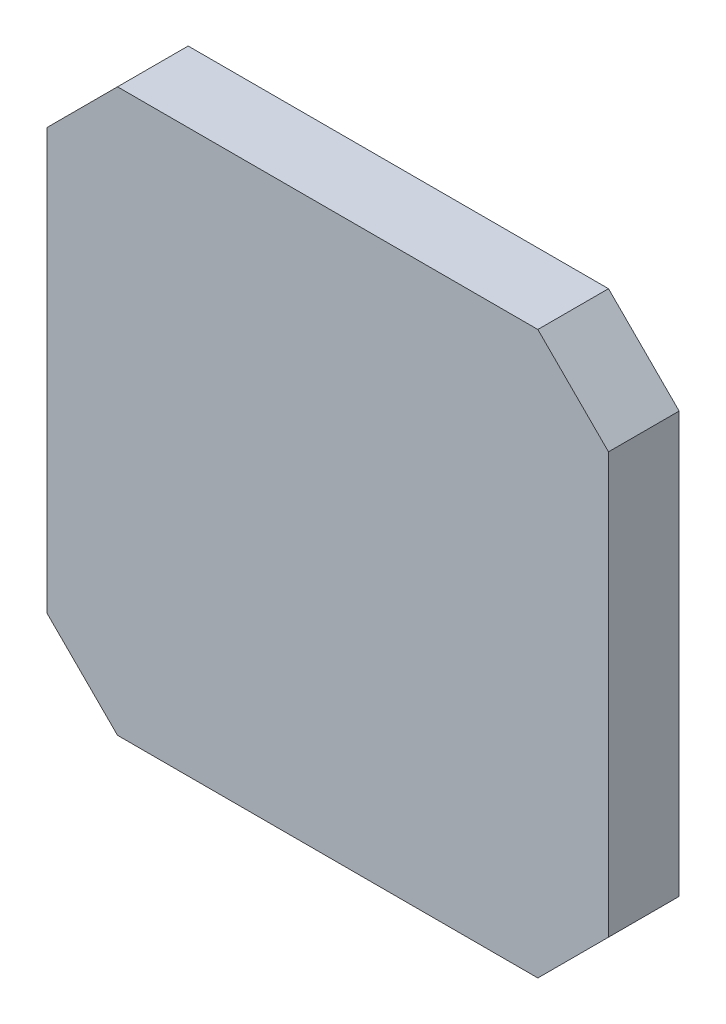
ISO-10303-21;
HEADER;
FILE_DESCRIPTION(('STEP AP214'),'2;1');
FILE_NAME('part.step','',(''),(''),'','','');
FILE_SCHEMA(('AUTOMOTIVE_DESIGN { 1 0 10303 214 1 1 1 1 }'));
ENDSEC;
DATA;
#1=APPLICATION_CONTEXT('core data for automotive mechanical design processes');
#2=APPLICATION_PROTOCOL_DEFINITION('international standard','automotive_design',2000,#1);
#3=PRODUCT_CONTEXT('',#1,'mechanical');
#4=PRODUCT('Part','Part','',(#3));
#5=PRODUCT_RELATED_PRODUCT_CATEGORY('part','',(#4));
#6=PRODUCT_DEFINITION_FORMATION('','',#4);
#7=PRODUCT_DEFINITION_CONTEXT('part definition',#1,'design');
#8=PRODUCT_DEFINITION('design','',#6,#7);
#9=PRODUCT_DEFINITION_SHAPE('','',#8);
#10=(LENGTH_UNIT() NAMED_UNIT(*) SI_UNIT(.MILLI.,.METRE.));
#11=(NAMED_UNIT(*) PLANE_ANGLE_UNIT() SI_UNIT($,.RADIAN.));
#12=(NAMED_UNIT(*) SI_UNIT($,.STERADIAN.) SOLID_ANGLE_UNIT());
#13=UNCERTAINTY_MEASURE_WITH_UNIT(LENGTH_MEASURE(1.E-05),#10,'distance_accuracy_value','');
#14=(GEOMETRIC_REPRESENTATION_CONTEXT(3) GLOBAL_UNCERTAINTY_ASSIGNED_CONTEXT((#13)) GLOBAL_UNIT_ASSIGNED_CONTEXT((#10,
#11,#12)) REPRESENTATION_CONTEXT('',''));
#15=CARTESIAN_POINT('',(0.,0.,0.));
#16=DIRECTION('',(0.,0.,1.));
#17=DIRECTION('',(1.,0.,0.));
#18=AXIS2_PLACEMENT_3D('',#15,#16,#17);
#19=CARTESIAN_POINT('',(79.5,79.5,20.));
#20=DIRECTION('',(-1.,0.,0.));
#21=DIRECTION('',(0.,0.,1.));
#22=AXIS2_PLACEMENT_3D('',#19,#20,#21);
#23=PLANE('',#22);
#24=DIRECTION('',(0.,1.,0.));
#25=VECTOR('',#24,1.);
#26=CARTESIAN_POINT('',(79.5,79.5,0.));
#27=LINE('',#26,#25);
#28=CARTESIAN_POINT('',(79.5,-59.4999999999999,0.));
#29=VERTEX_POINT('',#28);
#30=CARTESIAN_POINT('',(79.5,59.5,0.));
#31=VERTEX_POINT('',#30);
#32=EDGE_CURVE('E128',#29,#31,#27,.T.);
#33=ORIENTED_EDGE('',*,*,#32,.T.);
#34=DIRECTION('',(0.,0.,1.));
#35=VECTOR('',#34,1.);
#36=CARTESIAN_POINT('',(79.5,59.4999999999999,20.));
#37=LINE('',#36,#35);
#38=CARTESIAN_POINT('',(79.5,59.5,20.));
#39=VERTEX_POINT('',#38);
#40=EDGE_CURVE('E106',#31,#39,#37,.T.);
#41=ORIENTED_EDGE('',*,*,#40,.T.);
#42=DIRECTION('',(0.,1.,0.));
#43=VECTOR('',#42,1.);
#44=CARTESIAN_POINT('',(79.5,79.5,20.));
#45=LINE('',#44,#43);
#46=CARTESIAN_POINT('',(79.5,-59.4999999999999,20.));
#47=VERTEX_POINT('',#46);
#48=EDGE_CURVE('E137',#47,#39,#45,.T.);
#49=ORIENTED_EDGE('',*,*,#48,.F.);
#50=DIRECTION('',(0.,0.,-1.));
#51=VECTOR('',#50,1.);
#52=CARTESIAN_POINT('',(79.5,-59.5,20.));
#53=LINE('',#52,#51);
#54=EDGE_CURVE('E111',#47,#29,#53,.T.);
#55=ORIENTED_EDGE('',*,*,#54,.T.);
#56=EDGE_LOOP('',(#33,#41,#49,#55));
#57=FACE_BOUND('',#56,.T.);
#58=ADVANCED_FACE('F35',(#57),#23,.F.);
#59=CARTESIAN_POINT('',(-79.5,79.5,20.));
#60=DIRECTION('',(0.,-1.,0.));
#61=DIRECTION('',(0.,0.,-1.));
#62=AXIS2_PLACEMENT_3D('',#59,#60,#61);
#63=PLANE('',#62);
#64=DIRECTION('',(-1.,0.,0.));
#65=VECTOR('',#64,1.);
#66=CARTESIAN_POINT('',(-79.5,79.5,20.));
#67=LINE('',#66,#65);
#68=CARTESIAN_POINT('',(59.5,79.5,20.));
#69=VERTEX_POINT('',#68);
#70=CARTESIAN_POINT('',(-59.4999999999999,79.5,20.));
#71=VERTEX_POINT('',#70);
#72=EDGE_CURVE('E121',#69,#71,#67,.T.);
#73=ORIENTED_EDGE('',*,*,#72,.F.);
#74=DIRECTION('',(0.,0.,-1.));
#75=VECTOR('',#74,1.);
#76=CARTESIAN_POINT('',(59.5,79.5,20.));
#77=LINE('',#76,#75);
#78=CARTESIAN_POINT('',(59.5,79.5,0.));
#79=VERTEX_POINT('',#78);
#80=EDGE_CURVE('E105',#69,#79,#77,.T.);
#81=ORIENTED_EDGE('',*,*,#80,.T.);
#82=DIRECTION('',(-1.,0.,0.));
#83=VECTOR('',#82,1.);
#84=CARTESIAN_POINT('',(-79.5,79.5,0.));
#85=LINE('',#84,#83);
#86=CARTESIAN_POINT('',(-59.4999999999999,79.5,0.));
#87=VERTEX_POINT('',#86);
#88=EDGE_CURVE('E118',#79,#87,#85,.T.);
#89=ORIENTED_EDGE('',*,*,#88,.T.);
#90=DIRECTION('',(0.,0.,1.));
#91=VECTOR('',#90,1.);
#92=CARTESIAN_POINT('',(-59.4999999999999,79.5,20.));
#93=LINE('',#92,#91);
#94=EDGE_CURVE('E123',#87,#71,#93,.T.);
#95=ORIENTED_EDGE('',*,*,#94,.T.);
#96=EDGE_LOOP('',(#73,#81,#89,#95));
#97=FACE_BOUND('',#96,.T.);
#98=ADVANCED_FACE('F117',(#97),#63,.F.);
#99=CARTESIAN_POINT('',(-79.5,79.5,20.));
#100=DIRECTION('',(1.,0.,0.));
#101=DIRECTION('',(0.,1.,0.));
#102=AXIS2_PLACEMENT_3D('',#99,#100,#101);
#103=PLANE('',#102);
#104=DIRECTION('',(0.,-1.,0.));
#105=VECTOR('',#104,1.);
#106=CARTESIAN_POINT('',(-79.5,79.5,0.));
#107=LINE('',#106,#105);
#108=CARTESIAN_POINT('',(-79.5,59.5,0.));
#109=VERTEX_POINT('',#108);
#110=CARTESIAN_POINT('',(-79.5,-59.4999999999998,0.));
#111=VERTEX_POINT('',#110);
#112=EDGE_CURVE('E127',#109,#111,#107,.T.);
#113=ORIENTED_EDGE('',*,*,#112,.T.);
#114=DIRECTION('',(0.,0.,1.));
#115=VECTOR('',#114,1.);
#116=CARTESIAN_POINT('',(-79.5,-59.4999999999999,20.));
#117=LINE('',#116,#115);
#118=CARTESIAN_POINT('',(-79.5,-59.4999999999998,20.));
#119=VERTEX_POINT('',#118);
#120=EDGE_CURVE('E11',#111,#119,#117,.T.);
#121=ORIENTED_EDGE('',*,*,#120,.T.);
#122=DIRECTION('',(0.,-1.,0.));
#123=VECTOR('',#122,1.);
#124=CARTESIAN_POINT('',(-79.5,79.5,20.));
#125=LINE('',#124,#123);
#126=CARTESIAN_POINT('',(-79.5,59.5,20.));
#127=VERTEX_POINT('',#126);
#128=EDGE_CURVE('E163',#127,#119,#125,.T.);
#129=ORIENTED_EDGE('',*,*,#128,.F.);
#130=DIRECTION('',(0.,0.,-1.));
#131=VECTOR('',#130,1.);
#132=CARTESIAN_POINT('',(-79.5,59.5,20.));
#133=LINE('',#132,#131);
#134=EDGE_CURVE('E43',#127,#109,#133,.T.);
#135=ORIENTED_EDGE('',*,*,#134,.T.);
#136=EDGE_LOOP('',(#113,#121,#129,#135));
#137=FACE_BOUND('',#136,.T.);
#138=ADVANCED_FACE('F161',(#137),#103,.F.);
#139=CARTESIAN_POINT('',(-79.5,-79.5,20.));
#140=DIRECTION('',(0.,1.,0.));
#141=DIRECTION('',(0.,0.,1.));
#142=AXIS2_PLACEMENT_3D('',#139,#140,#141);
#143=PLANE('',#142);
#144=DIRECTION('',(1.,0.,0.));
#145=VECTOR('',#144,1.);
#146=CARTESIAN_POINT('',(-79.5,-79.5,0.));
#147=LINE('',#146,#145);
#148=CARTESIAN_POINT('',(-59.5,-79.5,0.));
#149=VERTEX_POINT('',#148);
#150=CARTESIAN_POINT('',(59.4999999999999,-79.5,0.));
#151=VERTEX_POINT('',#150);
#152=EDGE_CURVE('E131',#149,#151,#147,.T.);
#153=ORIENTED_EDGE('',*,*,#152,.T.);
#154=DIRECTION('',(0.,0.,1.));
#155=VECTOR('',#154,1.);
#156=CARTESIAN_POINT('',(59.4999999999999,-79.5,20.));
#157=LINE('',#156,#155);
#158=CARTESIAN_POINT('',(59.4999999999999,-79.5,20.));
#159=VERTEX_POINT('',#158);
#160=EDGE_CURVE('E50',#151,#159,#157,.T.);
#161=ORIENTED_EDGE('',*,*,#160,.T.);
#162=DIRECTION('',(1.,0.,0.));
#163=VECTOR('',#162,1.);
#164=CARTESIAN_POINT('',(-79.5,-79.5,20.));
#165=LINE('',#164,#163);
#166=CARTESIAN_POINT('',(-59.5,-79.5,20.));
#167=VERTEX_POINT('',#166);
#168=EDGE_CURVE('E138',#167,#159,#165,.T.);
#169=ORIENTED_EDGE('',*,*,#168,.F.);
#170=DIRECTION('',(0.,0.,-1.));
#171=VECTOR('',#170,1.);
#172=CARTESIAN_POINT('',(-59.5,-79.5,20.));
#173=LINE('',#172,#171);
#174=EDGE_CURVE('E154',#167,#149,#173,.T.);
#175=ORIENTED_EDGE('',*,*,#174,.T.);
#176=EDGE_LOOP('',(#153,#161,#169,#175));
#177=FACE_BOUND('',#176,.T.);
#178=ADVANCED_FACE('F170',(#177),#143,.F.);
#179=CARTESIAN_POINT('',(0.,0.,20.));
#180=DIRECTION('',(0.,0.,1.));
#181=DIRECTION('',(1.,0.,0.));
#182=AXIS2_PLACEMENT_3D('',#179,#180,#181);
#183=PLANE('',#182);
#184=ORIENTED_EDGE('',*,*,#48,.T.);
#185=DIRECTION('',(0.707106781186546,-0.707106781186549,0.));
#186=VECTOR('',#185,1.);
#187=CARTESIAN_POINT('',(69.5000000000001,69.4999999999998,20.));
#188=LINE('',#187,#186);
#189=EDGE_CURVE('E152',#39,#69,#188,.F.);
#190=ORIENTED_EDGE('',*,*,#189,.T.);
#191=ORIENTED_EDGE('',*,*,#72,.T.);
#192=DIRECTION('',(0.707106781186549,0.707106781186546,0.));
#193=VECTOR('',#192,1.);
#194=CARTESIAN_POINT('',(-69.4999999999998,69.5000000000001,20.));
#195=LINE('',#194,#193);
#196=EDGE_CURVE('E147',#71,#127,#195,.F.);
#197=ORIENTED_EDGE('',*,*,#196,.T.);
#198=ORIENTED_EDGE('',*,*,#128,.T.);
#199=DIRECTION('',(-0.707106781186546,0.707106781186549,0.));
#200=VECTOR('',#199,1.);
#201=CARTESIAN_POINT('',(-69.5000000000001,-69.4999999999998,20.));
#202=LINE('',#201,#200);
#203=EDGE_CURVE('E57',#119,#167,#202,.F.);
#204=ORIENTED_EDGE('',*,*,#203,.T.);
#205=ORIENTED_EDGE('',*,*,#168,.T.);
#206=DIRECTION('',(-0.707106781186549,-0.707106781186546,0.));
#207=VECTOR('',#206,1.);
#208=CARTESIAN_POINT('',(69.4999999999998,-69.5000000000001,20.));
#209=LINE('',#208,#207);
#210=EDGE_CURVE('E150',#159,#47,#209,.F.);
#211=ORIENTED_EDGE('',*,*,#210,.T.);
#212=EDGE_LOOP('',(#184,#190,#191,#197,#198,#204,#205,#211));
#213=FACE_BOUND('',#212,.T.);
#214=ADVANCED_FACE('F177',(#213),#183,.T.);
#215=CARTESIAN_POINT('',(0.,0.,0.));
#216=DIRECTION('',(0.,0.,1.));
#217=DIRECTION('',(1.,0.,0.));
#218=AXIS2_PLACEMENT_3D('',#215,#216,#217);
#219=PLANE('',#218);
#220=ORIENTED_EDGE('',*,*,#88,.F.);
#221=DIRECTION('',(-0.707106781186546,0.707106781186549,0.));
#222=VECTOR('',#221,1.);
#223=CARTESIAN_POINT('',(59.5,79.5,0.));
#224=LINE('',#223,#222);
#225=EDGE_CURVE('E101',#79,#31,#224,.F.);
#226=ORIENTED_EDGE('',*,*,#225,.T.);
#227=ORIENTED_EDGE('',*,*,#32,.F.);
#228=DIRECTION('',(0.707106781186549,0.707106781186546,0.));
#229=VECTOR('',#228,1.);
#230=CARTESIAN_POINT('',(79.5,-59.5,0.));
#231=LINE('',#230,#229);
#232=EDGE_CURVE('E112',#29,#151,#231,.F.);
#233=ORIENTED_EDGE('',*,*,#232,.T.);
#234=ORIENTED_EDGE('',*,*,#152,.F.);
#235=DIRECTION('',(0.707106781186546,-0.707106781186549,0.));
#236=VECTOR('',#235,1.);
#237=CARTESIAN_POINT('',(-59.5,-79.5,0.));
#238=LINE('',#237,#236);
#239=EDGE_CURVE('E141',#149,#111,#238,.F.);
#240=ORIENTED_EDGE('',*,*,#239,.T.);
#241=ORIENTED_EDGE('',*,*,#112,.F.);
#242=DIRECTION('',(-0.707106781186549,-0.707106781186546,0.));
#243=VECTOR('',#242,1.);
#244=CARTESIAN_POINT('',(-79.5,59.5,0.));
#245=LINE('',#244,#243);
#246=EDGE_CURVE('E122',#109,#87,#245,.F.);
#247=ORIENTED_EDGE('',*,*,#246,.T.);
#248=EDGE_LOOP('',(#220,#226,#227,#233,#234,#240,#241,#247));
#249=FACE_BOUND('',#248,.T.);
#250=ADVANCED_FACE('F125',(#249),#219,.F.);
#251=CARTESIAN_POINT('',(59.5,79.5,20.));
#252=DIRECTION('',(-0.707106781186549,-0.707106781186546,0.));
#253=DIRECTION('',(0.,0.,-1.));
#254=AXIS2_PLACEMENT_3D('',#251,#252,#253);
#255=PLANE('',#254);
#256=ORIENTED_EDGE('',*,*,#189,.F.);
#257=ORIENTED_EDGE('',*,*,#40,.F.);
#258=ORIENTED_EDGE('',*,*,#225,.F.);
#259=ORIENTED_EDGE('',*,*,#80,.F.);
#260=EDGE_LOOP('',(#256,#257,#258,#259));
#261=FACE_BOUND('',#260,.T.);
#262=ADVANCED_FACE('F104',(#261),#255,.F.);
#263=CARTESIAN_POINT('',(79.5,-59.5,20.));
#264=DIRECTION('',(-0.707106781186546,0.707106781186549,0.));
#265=DIRECTION('',(0.,0.,-1.));
#266=AXIS2_PLACEMENT_3D('',#263,#264,#265);
#267=PLANE('',#266);
#268=ORIENTED_EDGE('',*,*,#210,.F.);
#269=ORIENTED_EDGE('',*,*,#160,.F.);
#270=ORIENTED_EDGE('',*,*,#232,.F.);
#271=ORIENTED_EDGE('',*,*,#54,.F.);
#272=EDGE_LOOP('',(#268,#269,#270,#271));
#273=FACE_BOUND('',#272,.T.);
#274=ADVANCED_FACE('F181',(#273),#267,.F.);
#275=CARTESIAN_POINT('',(-59.5,-79.5,20.));
#276=DIRECTION('',(0.707106781186549,0.707106781186546,0.));
#277=DIRECTION('',(0.,0.,-1.));
#278=AXIS2_PLACEMENT_3D('',#275,#276,#277);
#279=PLANE('',#278);
#280=ORIENTED_EDGE('',*,*,#203,.F.);
#281=ORIENTED_EDGE('',*,*,#120,.F.);
#282=ORIENTED_EDGE('',*,*,#239,.F.);
#283=ORIENTED_EDGE('',*,*,#174,.F.);
#284=EDGE_LOOP('',(#280,#281,#282,#283));
#285=FACE_BOUND('',#284,.T.);
#286=ADVANCED_FACE('F169',(#285),#279,.F.);
#287=CARTESIAN_POINT('',(-79.5,59.5,20.));
#288=DIRECTION('',(0.707106781186546,-0.707106781186549,0.));
#289=DIRECTION('',(0.,0.,-1.));
#290=AXIS2_PLACEMENT_3D('',#287,#288,#289);
#291=PLANE('',#290);
#292=ORIENTED_EDGE('',*,*,#196,.F.);
#293=ORIENTED_EDGE('',*,*,#94,.F.);
#294=ORIENTED_EDGE('',*,*,#246,.F.);
#295=ORIENTED_EDGE('',*,*,#134,.F.);
#296=EDGE_LOOP('',(#292,#293,#294,#295));
#297=FACE_BOUND('',#296,.T.);
#298=ADVANCED_FACE('F37',(#297),#291,.F.);
#299=CLOSED_SHELL('',(#58,#98,#138,#178,#214,#250,#262,#274,#286,#298));
#300=MANIFOLD_SOLID_BREP('B2',#299);
#301=ADVANCED_BREP_SHAPE_REPRESENTATION('',(#18,#300),#14);
#302=SHAPE_DEFINITION_REPRESENTATION(#9,#301);
ENDSEC;
END-ISO-10303-21;
